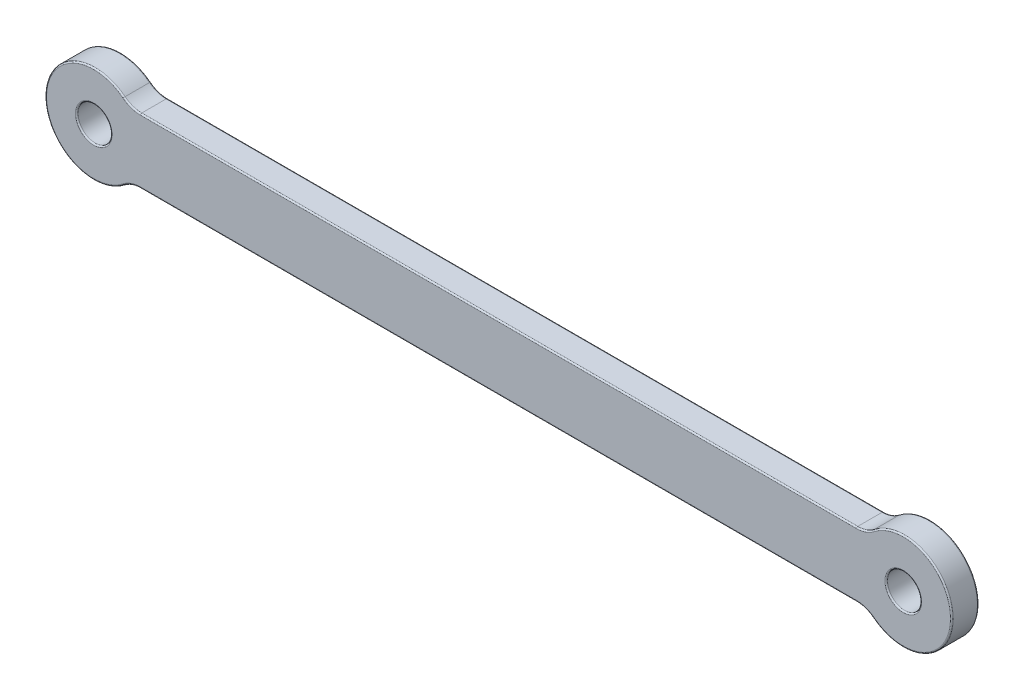
ISO-10303-21;
HEADER;
FILE_DESCRIPTION(('STEP AP214'),'2;1');
FILE_NAME('part.step','',(''),(''),'','','');
FILE_SCHEMA(('AUTOMOTIVE_DESIGN { 1 0 10303 214 1 1 1 1 }'));
ENDSEC;
DATA;
#1=APPLICATION_CONTEXT('core data for automotive mechanical design processes');
#2=APPLICATION_PROTOCOL_DEFINITION('international standard','automotive_design',2000,#1);
#3=PRODUCT_CONTEXT('',#1,'mechanical');
#4=PRODUCT('Part','Part','',(#3));
#5=PRODUCT_RELATED_PRODUCT_CATEGORY('part','',(#4));
#6=PRODUCT_DEFINITION_FORMATION('','',#4);
#7=PRODUCT_DEFINITION_CONTEXT('part definition',#1,'design');
#8=PRODUCT_DEFINITION('design','',#6,#7);
#9=PRODUCT_DEFINITION_SHAPE('','',#8);
#10=(LENGTH_UNIT() NAMED_UNIT(*) SI_UNIT(.MILLI.,.METRE.));
#11=(NAMED_UNIT(*) PLANE_ANGLE_UNIT() SI_UNIT($,.RADIAN.));
#12=(NAMED_UNIT(*) SI_UNIT($,.STERADIAN.) SOLID_ANGLE_UNIT());
#13=UNCERTAINTY_MEASURE_WITH_UNIT(LENGTH_MEASURE(1.E-05),#10,'distance_accuracy_value','');
#14=(GEOMETRIC_REPRESENTATION_CONTEXT(3) GLOBAL_UNCERTAINTY_ASSIGNED_CONTEXT((#13)) GLOBAL_UNIT_ASSIGNED_CONTEXT((#10,
#11,#12)) REPRESENTATION_CONTEXT('',''));
#15=CARTESIAN_POINT('',(0.,0.,0.));
#16=DIRECTION('',(0.,0.,1.));
#17=DIRECTION('',(1.,0.,0.));
#18=AXIS2_PLACEMENT_3D('',#15,#16,#17);
#19=CARTESIAN_POINT('',(150.,0.,5.));
#20=DIRECTION('',(0.,0.,-1.));
#21=DIRECTION('',(-1.,0.,0.));
#22=AXIS2_PLACEMENT_3D('',#19,#20,#21);
#23=CYLINDRICAL_SURFACE('',#22,9.00000000000001);
#24=DIRECTION('',(0.,0.,-1.));
#25=VECTOR('',#24,1.);
#26=CARTESIAN_POINT('',(144.432693832814,-7.07142857142858,5.));
#27=LINE('',#26,#25);
#28=CARTESIAN_POINT('',(144.432693832814,-7.07142857142858,4.75));
#29=VERTEX_POINT('',#28);
#30=CARTESIAN_POINT('',(144.432693832814,-7.07142857142858,0.25));
#31=VERTEX_POINT('',#30);
#32=EDGE_CURVE('E368',#29,#31,#27,.T.);
#33=ORIENTED_EDGE('',*,*,#32,.T.);
#34=CARTESIAN_POINT('',(150.,0.,0.25));
#35=DIRECTION('',(0.,0.,1.));
#36=DIRECTION('',(1.,0.,0.));
#37=AXIS2_PLACEMENT_3D('',#34,#35,#36);
#38=CIRCLE('',#37,9.00000000000001);
#39=CARTESIAN_POINT('',(144.432693832814,7.07142857142858,0.25));
#40=VERTEX_POINT('',#39);
#41=EDGE_CURVE('E251',#31,#40,#38,.T.);
#42=ORIENTED_EDGE('',*,*,#41,.T.);
#43=DIRECTION('',(0.,0.,-1.));
#44=VECTOR('',#43,1.);
#45=CARTESIAN_POINT('',(144.432693832814,7.07142857142858,5.));
#46=LINE('',#45,#44);
#47=CARTESIAN_POINT('',(144.432693832814,7.07142857142858,4.75));
#48=VERTEX_POINT('',#47);
#49=EDGE_CURVE('E374',#40,#48,#46,.F.);
#50=ORIENTED_EDGE('',*,*,#49,.T.);
#51=CARTESIAN_POINT('',(150.,0.,4.75));
#52=DIRECTION('',(0.,0.,1.));
#53=DIRECTION('',(1.,0.,0.));
#54=AXIS2_PLACEMENT_3D('',#51,#52,#53);
#55=CIRCLE('',#54,9.00000000000001);
#56=EDGE_CURVE('E248',#48,#29,#55,.F.);
#57=ORIENTED_EDGE('',*,*,#56,.T.);
#58=EDGE_LOOP('',(#33,#42,#50,#57));
#59=FACE_BOUND('',#58,.T.);
#60=ADVANCED_FACE('F43',(#59),#23,.T.);
#61=CARTESIAN_POINT('',(0.,6.,5.));
#62=DIRECTION('',(0.,1.,0.));
#63=DIRECTION('',(0.,0.,1.));
#64=AXIS2_PLACEMENT_3D('',#61,#62,#63);
#65=PLANE('',#64);
#66=DIRECTION('',(0.,0.,1.));
#67=VECTOR('',#66,1.);
#68=CARTESIAN_POINT('',(141.339745962156,6.,0.));
#69=LINE('',#68,#67);
#70=CARTESIAN_POINT('',(141.339745962156,6.,4.75));
#71=VERTEX_POINT('',#70);
#72=CARTESIAN_POINT('',(141.339745962156,6.,0.25));
#73=VERTEX_POINT('',#72);
#74=EDGE_CURVE('E181',#71,#73,#69,.F.);
#75=ORIENTED_EDGE('',*,*,#74,.T.);
#76=DIRECTION('',(1.,0.,0.));
#77=VECTOR('',#76,1.);
#78=CARTESIAN_POINT('',(8.66025403784439,6.,0.25));
#79=LINE('',#78,#77);
#80=CARTESIAN_POINT('',(8.66025403784439,6.,0.25));
#81=VERTEX_POINT('',#80);
#82=EDGE_CURVE('E263',#73,#81,#79,.F.);
#83=ORIENTED_EDGE('',*,*,#82,.T.);
#84=DIRECTION('',(0.,0.,-1.));
#85=VECTOR('',#84,1.);
#86=CARTESIAN_POINT('',(8.66025403784439,6.,5.));
#87=LINE('',#86,#85);
#88=CARTESIAN_POINT('',(8.66025403784439,6.,4.75));
#89=VERTEX_POINT('',#88);
#90=EDGE_CURVE('E360',#81,#89,#87,.F.);
#91=ORIENTED_EDGE('',*,*,#90,.T.);
#92=DIRECTION('',(1.,0.,0.));
#93=VECTOR('',#92,1.);
#94=CARTESIAN_POINT('',(0.,6.,4.75));
#95=LINE('',#94,#93);
#96=EDGE_CURVE('E260',#89,#71,#95,.T.);
#97=ORIENTED_EDGE('',*,*,#96,.T.);
#98=EDGE_LOOP('',(#75,#83,#91,#97));
#99=FACE_BOUND('',#98,.T.);
#100=ADVANCED_FACE('F365',(#99),#65,.T.);
#101=CARTESIAN_POINT('',(0.,0.,5.));
#102=DIRECTION('',(0.,0.,-1.));
#103=DIRECTION('',(-1.,0.,0.));
#104=AXIS2_PLACEMENT_3D('',#101,#102,#103);
#105=CYLINDRICAL_SURFACE('',#104,9.);
#106=DIRECTION('',(0.,0.,-1.));
#107=VECTOR('',#106,1.);
#108=CARTESIAN_POINT('',(5.56730616718568,7.07142857142857,5.));
#109=LINE('',#108,#107);
#110=CARTESIAN_POINT('',(5.56730616718568,7.07142857142857,4.75));
#111=VERTEX_POINT('',#110);
#112=CARTESIAN_POINT('',(5.56730616718568,7.07142857142857,0.25));
#113=VERTEX_POINT('',#112);
#114=EDGE_CURVE('E362',#111,#113,#109,.T.);
#115=ORIENTED_EDGE('',*,*,#114,.T.);
#116=CARTESIAN_POINT('',(0.,0.,0.25));
#117=DIRECTION('',(0.,0.,1.));
#118=DIRECTION('',(1.,0.,0.));
#119=AXIS2_PLACEMENT_3D('',#116,#117,#118);
#120=CIRCLE('',#119,9.);
#121=CARTESIAN_POINT('',(5.56730616718568,-7.07142857142857,0.25));
#122=VERTEX_POINT('',#121);
#123=EDGE_CURVE('E226',#113,#122,#120,.T.);
#124=ORIENTED_EDGE('',*,*,#123,.T.);
#125=DIRECTION('',(0.,0.,-1.));
#126=VECTOR('',#125,1.);
#127=CARTESIAN_POINT('',(5.56730616718568,-7.07142857142857,5.));
#128=LINE('',#127,#126);
#129=CARTESIAN_POINT('',(5.56730616718568,-7.07142857142857,4.75));
#130=VERTEX_POINT('',#129);
#131=EDGE_CURVE('E404',#122,#130,#128,.F.);
#132=ORIENTED_EDGE('',*,*,#131,.T.);
#133=CARTESIAN_POINT('',(0.,0.,4.75));
#134=DIRECTION('',(0.,0.,1.));
#135=DIRECTION('',(1.,0.,0.));
#136=AXIS2_PLACEMENT_3D('',#133,#134,#135);
#137=CIRCLE('',#136,9.);
#138=EDGE_CURVE('E223',#130,#111,#137,.F.);
#139=ORIENTED_EDGE('',*,*,#138,.T.);
#140=EDGE_LOOP('',(#115,#124,#132,#139));
#141=FACE_BOUND('',#140,.T.);
#142=ADVANCED_FACE('F402',(#141),#105,.T.);
#143=CARTESIAN_POINT('',(150.,0.,5.));
#144=DIRECTION('',(0.,0.,-1.));
#145=DIRECTION('',(-1.,0.,0.));
#146=AXIS2_PLACEMENT_3D('',#143,#144,#145);
#147=CYLINDRICAL_SURFACE('',#146,3.15000000000001);
#148=CARTESIAN_POINT('',(150.,0.,0.25));
#149=DIRECTION('',(0.,0.,1.));
#150=DIRECTION('',(1.,0.,0.));
#151=AXIS2_PLACEMENT_3D('',#148,#149,#150);
#152=CIRCLE('',#151,3.15000000000001);
#153=CARTESIAN_POINT('',(153.15,0.,0.25));
#154=VERTEX_POINT('',#153);
#155=EDGE_CURVE('E214',#154,#154,#152,.F.);
#156=ORIENTED_EDGE('',*,*,#155,.T.);
#157=EDGE_LOOP('',(#156));
#158=FACE_BOUND('',#157,.T.);
#159=CARTESIAN_POINT('',(150.,0.,4.75));
#160=DIRECTION('',(0.,0.,1.));
#161=DIRECTION('',(1.,0.,0.));
#162=AXIS2_PLACEMENT_3D('',#159,#160,#161);
#163=CIRCLE('',#162,3.15000000000001);
#164=CARTESIAN_POINT('',(153.15,0.,4.75));
#165=VERTEX_POINT('',#164);
#166=EDGE_CURVE('E210',#165,#165,#163,.T.);
#167=ORIENTED_EDGE('',*,*,#166,.T.);
#168=EDGE_LOOP('',(#167));
#169=FACE_BOUND('',#168,.T.);
#170=ADVANCED_FACE('F720',(#158,#169),#147,.F.);
#171=CARTESIAN_POINT('',(0.,-6.,5.));
#172=DIRECTION('',(0.,1.,0.));
#173=DIRECTION('',(0.,0.,1.));
#174=AXIS2_PLACEMENT_3D('',#171,#172,#173);
#175=PLANE('',#174);
#176=DIRECTION('',(0.,0.,1.));
#177=VECTOR('',#176,1.);
#178=CARTESIAN_POINT('',(8.66025403784439,-6.,0.));
#179=LINE('',#178,#177);
#180=CARTESIAN_POINT('',(8.66025403784439,-6.,4.75));
#181=VERTEX_POINT('',#180);
#182=CARTESIAN_POINT('',(8.66025403784439,-6.,0.25));
#183=VERTEX_POINT('',#182);
#184=EDGE_CURVE('E405',#181,#183,#179,.F.);
#185=ORIENTED_EDGE('',*,*,#184,.T.);
#186=DIRECTION('',(1.,0.,0.));
#187=VECTOR('',#186,1.);
#188=CARTESIAN_POINT('',(0.,-6.,0.25));
#189=LINE('',#188,#187);
#190=CARTESIAN_POINT('',(141.339745962156,-6.,0.25));
#191=VERTEX_POINT('',#190);
#192=EDGE_CURVE('E238',#183,#191,#189,.T.);
#193=ORIENTED_EDGE('',*,*,#192,.T.);
#194=DIRECTION('',(0.,0.,-1.));
#195=VECTOR('',#194,1.);
#196=CARTESIAN_POINT('',(141.339745962156,-6.,5.));
#197=LINE('',#196,#195);
#198=CARTESIAN_POINT('',(141.339745962156,-6.,4.75));
#199=VERTEX_POINT('',#198);
#200=EDGE_CURVE('E315',#191,#199,#197,.F.);
#201=ORIENTED_EDGE('',*,*,#200,.T.);
#202=DIRECTION('',(1.,0.,0.));
#203=VECTOR('',#202,1.);
#204=CARTESIAN_POINT('',(8.66025403784439,-6.,4.75));
#205=LINE('',#204,#203);
#206=EDGE_CURVE('E235',#199,#181,#205,.F.);
#207=ORIENTED_EDGE('',*,*,#206,.T.);
#208=EDGE_LOOP('',(#185,#193,#201,#207));
#209=FACE_BOUND('',#208,.T.);
#210=ADVANCED_FACE('F442',(#209),#175,.F.);
#211=CARTESIAN_POINT('',(0.,0.,5.));
#212=DIRECTION('',(0.,0.,-1.));
#213=DIRECTION('',(-1.,0.,0.));
#214=AXIS2_PLACEMENT_3D('',#211,#212,#213);
#215=CYLINDRICAL_SURFACE('',#214,3.15);
#216=CARTESIAN_POINT('',(0.,0.,0.25));
#217=DIRECTION('',(0.,0.,1.));
#218=DIRECTION('',(1.,0.,0.));
#219=AXIS2_PLACEMENT_3D('',#216,#217,#218);
#220=CIRCLE('',#219,3.15);
#221=CARTESIAN_POINT('',(3.15,0.,0.25));
#222=VERTEX_POINT('',#221);
#223=EDGE_CURVE('E206',#222,#222,#220,.F.);
#224=ORIENTED_EDGE('',*,*,#223,.T.);
#225=EDGE_LOOP('',(#224));
#226=FACE_BOUND('',#225,.T.);
#227=CARTESIAN_POINT('',(0.,0.,4.75));
#228=DIRECTION('',(0.,0.,1.));
#229=DIRECTION('',(1.,0.,0.));
#230=AXIS2_PLACEMENT_3D('',#227,#228,#229);
#231=CIRCLE('',#230,3.15);
#232=CARTESIAN_POINT('',(3.15,0.,4.75));
#233=VERTEX_POINT('',#232);
#234=EDGE_CURVE('E202',#233,#233,#231,.T.);
#235=ORIENTED_EDGE('',*,*,#234,.T.);
#236=EDGE_LOOP('',(#235));
#237=FACE_BOUND('',#236,.T.);
#238=ADVANCED_FACE('F696',(#226,#237),#215,.F.);
#239=CARTESIAN_POINT('',(0.,0.,5.));
#240=DIRECTION('',(0.,0.,1.));
#241=DIRECTION('',(1.,0.,0.));
#242=AXIS2_PLACEMENT_3D('',#239,#240,#241);
#243=PLANE('',#242);
#244=CARTESIAN_POINT('',(0.,0.,5.));
#245=DIRECTION('',(0.,0.,1.));
#246=DIRECTION('',(1.,0.,0.));
#247=AXIS2_PLACEMENT_3D('',#244,#245,#246);
#248=CIRCLE('',#247,3.4);
#249=CARTESIAN_POINT('',(3.4,0.,5.));
#250=VERTEX_POINT('',#249);
#251=EDGE_CURVE('E11',#250,#250,#248,.F.);
#252=ORIENTED_EDGE('',*,*,#251,.T.);
#253=EDGE_LOOP('',(#252));
#254=FACE_BOUND('',#253,.T.);
#255=CARTESIAN_POINT('',(150.,0.,5.));
#256=DIRECTION('',(0.,0.,1.));
#257=DIRECTION('',(1.,0.,0.));
#258=AXIS2_PLACEMENT_3D('',#255,#256,#257);
#259=CIRCLE('',#258,3.40000000000001);
#260=CARTESIAN_POINT('',(153.4,0.,5.));
#261=VERTEX_POINT('',#260);
#262=EDGE_CURVE('E53',#261,#261,#259,.F.);
#263=ORIENTED_EDGE('',*,*,#262,.T.);
#264=EDGE_LOOP('',(#263));
#265=FACE_BOUND('',#264,.T.);
#266=DIRECTION('',(1.,0.,0.));
#267=VECTOR('',#266,1.);
#268=CARTESIAN_POINT('',(141.339745962156,-5.75,5.));
#269=LINE('',#268,#267);
#270=CARTESIAN_POINT('',(8.66025403784439,-5.75,5.));
#271=VERTEX_POINT('',#270);
#272=CARTESIAN_POINT('',(141.339745962156,-5.75,5.));
#273=VERTEX_POINT('',#272);
#274=EDGE_CURVE('E61',#271,#273,#269,.T.);
#275=ORIENTED_EDGE('',*,*,#274,.T.);
#276=CARTESIAN_POINT('',(141.339745962156,-11.,5.));
#277=DIRECTION('',(0.,0.,1.));
#278=DIRECTION('',(1.,0.,0.));
#279=AXIS2_PLACEMENT_3D('',#276,#277,#278);
#280=CIRCLE('',#279,5.25);
#281=CARTESIAN_POINT('',(144.587341226347,-6.87500000000001,5.));
#282=VERTEX_POINT('',#281);
#283=EDGE_CURVE('E285',#273,#282,#280,.F.);
#284=ORIENTED_EDGE('',*,*,#283,.T.);
#285=CARTESIAN_POINT('',(150.,0.,5.));
#286=DIRECTION('',(0.,0.,1.));
#287=DIRECTION('',(1.,0.,0.));
#288=AXIS2_PLACEMENT_3D('',#285,#286,#287);
#289=CIRCLE('',#288,8.75000000000001);
#290=CARTESIAN_POINT('',(144.587341226347,6.87500000000001,5.));
#291=VERTEX_POINT('',#290);
#292=EDGE_CURVE('E266',#282,#291,#289,.T.);
#293=ORIENTED_EDGE('',*,*,#292,.T.);
#294=CARTESIAN_POINT('',(141.339745962156,11.,5.));
#295=DIRECTION('',(0.,0.,1.));
#296=DIRECTION('',(1.,0.,0.));
#297=AXIS2_PLACEMENT_3D('',#294,#295,#296);
#298=CIRCLE('',#297,5.25);
#299=CARTESIAN_POINT('',(141.339745962156,5.75,5.));
#300=VERTEX_POINT('',#299);
#301=EDGE_CURVE('E269',#291,#300,#298,.F.);
#302=ORIENTED_EDGE('',*,*,#301,.T.);
#303=DIRECTION('',(1.,0.,0.));
#304=VECTOR('',#303,1.);
#305=CARTESIAN_POINT('',(0.,5.75,5.));
#306=LINE('',#305,#304);
#307=CARTESIAN_POINT('',(8.66025403784439,5.75,5.));
#308=VERTEX_POINT('',#307);
#309=EDGE_CURVE('E272',#300,#308,#306,.F.);
#310=ORIENTED_EDGE('',*,*,#309,.T.);
#311=CARTESIAN_POINT('',(8.66025403784439,11.,5.));
#312=DIRECTION('',(0.,0.,1.));
#313=DIRECTION('',(1.,0.,0.));
#314=AXIS2_PLACEMENT_3D('',#311,#312,#313);
#315=CIRCLE('',#314,5.25);
#316=CARTESIAN_POINT('',(5.41265877365274,6.875,5.));
#317=VERTEX_POINT('',#316);
#318=EDGE_CURVE('E275',#308,#317,#315,.F.);
#319=ORIENTED_EDGE('',*,*,#318,.T.);
#320=CARTESIAN_POINT('',(0.,0.,5.));
#321=DIRECTION('',(0.,0.,1.));
#322=DIRECTION('',(1.,0.,0.));
#323=AXIS2_PLACEMENT_3D('',#320,#321,#322);
#324=CIRCLE('',#323,8.75);
#325=CARTESIAN_POINT('',(5.41265877365274,-6.875,5.));
#326=VERTEX_POINT('',#325);
#327=EDGE_CURVE('E278',#317,#326,#324,.T.);
#328=ORIENTED_EDGE('',*,*,#327,.T.);
#329=CARTESIAN_POINT('',(8.66025403784439,-11.,5.));
#330=DIRECTION('',(0.,0.,1.));
#331=DIRECTION('',(1.,0.,0.));
#332=AXIS2_PLACEMENT_3D('',#329,#330,#331);
#333=CIRCLE('',#332,5.25);
#334=EDGE_CURVE('E66',#326,#271,#333,.F.);
#335=ORIENTED_EDGE('',*,*,#334,.T.);
#336=EDGE_LOOP('',(#275,#284,#293,#302,#310,#319,#328,#335));
#337=FACE_BOUND('',#336,.T.);
#338=ADVANCED_FACE('F462',(#254,#265,#337),#243,.T.);
#339=CARTESIAN_POINT('',(0.,0.,0.));
#340=DIRECTION('',(0.,0.,1.));
#341=DIRECTION('',(1.,0.,0.));
#342=AXIS2_PLACEMENT_3D('',#339,#340,#341);
#343=PLANE('',#342);
#344=CARTESIAN_POINT('',(0.,0.,0.));
#345=DIRECTION('',(0.,0.,1.));
#346=DIRECTION('',(1.,0.,0.));
#347=AXIS2_PLACEMENT_3D('',#344,#345,#346);
#348=CIRCLE('',#347,3.4);
#349=CARTESIAN_POINT('',(3.4,0.,0.));
#350=VERTEX_POINT('',#349);
#351=EDGE_CURVE('E193',#350,#350,#348,.T.);
#352=ORIENTED_EDGE('',*,*,#351,.T.);
#353=EDGE_LOOP('',(#352));
#354=FACE_BOUND('',#353,.T.);
#355=CARTESIAN_POINT('',(150.,0.,0.));
#356=DIRECTION('',(0.,0.,1.));
#357=DIRECTION('',(1.,0.,0.));
#358=AXIS2_PLACEMENT_3D('',#355,#356,#357);
#359=CIRCLE('',#358,3.40000000000001);
#360=CARTESIAN_POINT('',(153.4,0.,0.));
#361=VERTEX_POINT('',#360);
#362=EDGE_CURVE('E188',#361,#361,#359,.T.);
#363=ORIENTED_EDGE('',*,*,#362,.T.);
#364=EDGE_LOOP('',(#363));
#365=FACE_BOUND('',#364,.T.);
#366=CARTESIAN_POINT('',(0.,0.,0.));
#367=DIRECTION('',(0.,0.,1.));
#368=DIRECTION('',(1.,0.,0.));
#369=AXIS2_PLACEMENT_3D('',#366,#367,#368);
#370=CIRCLE('',#369,8.75);
#371=CARTESIAN_POINT('',(5.41265877365274,-6.875,0.));
#372=VERTEX_POINT('',#371);
#373=CARTESIAN_POINT('',(5.41265877365274,6.875,0.));
#374=VERTEX_POINT('',#373);
#375=EDGE_CURVE('E185',#372,#374,#370,.F.);
#376=ORIENTED_EDGE('',*,*,#375,.T.);
#377=CARTESIAN_POINT('',(8.66025403784439,11.,0.));
#378=DIRECTION('',(0.,0.,1.));
#379=DIRECTION('',(1.,0.,0.));
#380=AXIS2_PLACEMENT_3D('',#377,#378,#379);
#381=CIRCLE('',#380,5.25);
#382=CARTESIAN_POINT('',(8.66025403784439,5.75,0.));
#383=VERTEX_POINT('',#382);
#384=EDGE_CURVE('E164',#374,#383,#381,.T.);
#385=ORIENTED_EDGE('',*,*,#384,.T.);
#386=DIRECTION('',(1.,0.,0.));
#387=VECTOR('',#386,1.);
#388=CARTESIAN_POINT('',(141.339745962156,5.75,0.));
#389=LINE('',#388,#387);
#390=CARTESIAN_POINT('',(141.339745962156,5.75,0.));
#391=VERTEX_POINT('',#390);
#392=EDGE_CURVE('E173',#383,#391,#389,.T.);
#393=ORIENTED_EDGE('',*,*,#392,.T.);
#394=CARTESIAN_POINT('',(141.339745962156,11.,0.));
#395=DIRECTION('',(0.,0.,1.));
#396=DIRECTION('',(1.,0.,0.));
#397=AXIS2_PLACEMENT_3D('',#394,#395,#396);
#398=CIRCLE('',#397,5.25);
#399=CARTESIAN_POINT('',(144.587341226347,6.87500000000001,0.));
#400=VERTEX_POINT('',#399);
#401=EDGE_CURVE('E180',#391,#400,#398,.T.);
#402=ORIENTED_EDGE('',*,*,#401,.T.);
#403=CARTESIAN_POINT('',(150.,0.,0.));
#404=DIRECTION('',(0.,0.,1.));
#405=DIRECTION('',(1.,0.,0.));
#406=AXIS2_PLACEMENT_3D('',#403,#404,#405);
#407=CIRCLE('',#406,8.75000000000001);
#408=CARTESIAN_POINT('',(144.587341226347,-6.87500000000001,0.));
#409=VERTEX_POINT('',#408);
#410=EDGE_CURVE('E380',#400,#409,#407,.F.);
#411=ORIENTED_EDGE('',*,*,#410,.T.);
#412=CARTESIAN_POINT('',(141.339745962156,-11.,0.));
#413=DIRECTION('',(0.,0.,1.));
#414=DIRECTION('',(1.,0.,0.));
#415=AXIS2_PLACEMENT_3D('',#412,#413,#414);
#416=CIRCLE('',#415,5.25);
#417=CARTESIAN_POINT('',(141.339745962156,-5.75,0.));
#418=VERTEX_POINT('',#417);
#419=EDGE_CURVE('E383',#409,#418,#416,.T.);
#420=ORIENTED_EDGE('',*,*,#419,.T.);
#421=DIRECTION('',(1.,0.,0.));
#422=VECTOR('',#421,1.);
#423=CARTESIAN_POINT('',(0.,-5.75,0.));
#424=LINE('',#423,#422);
#425=CARTESIAN_POINT('',(8.66025403784439,-5.75,0.));
#426=VERTEX_POINT('',#425);
#427=EDGE_CURVE('E386',#418,#426,#424,.F.);
#428=ORIENTED_EDGE('',*,*,#427,.T.);
#429=CARTESIAN_POINT('',(8.66025403784439,-11.,0.));
#430=DIRECTION('',(0.,0.,1.));
#431=DIRECTION('',(1.,0.,0.));
#432=AXIS2_PLACEMENT_3D('',#429,#430,#431);
#433=CIRCLE('',#432,5.25);
#434=EDGE_CURVE('E195',#426,#372,#433,.T.);
#435=ORIENTED_EDGE('',*,*,#434,.T.);
#436=EDGE_LOOP('',(#376,#385,#393,#402,#411,#420,#428,#435));
#437=FACE_BOUND('',#436,.T.);
#438=ADVANCED_FACE('F183',(#354,#365,#437),#343,.F.);
#439=CARTESIAN_POINT('',(8.66025403784439,-11.,5.));
#440=DIRECTION('',(0.,0.,-1.));
#441=DIRECTION('',(-1.,0.,0.));
#442=AXIS2_PLACEMENT_3D('',#439,#440,#441);
#443=CYLINDRICAL_SURFACE('',#442,5.);
#444=ORIENTED_EDGE('',*,*,#131,.F.);
#445=CARTESIAN_POINT('',(8.66025403784439,-11.,0.25));
#446=DIRECTION('',(0.,0.,1.));
#447=DIRECTION('',(1.,0.,0.));
#448=AXIS2_PLACEMENT_3D('',#445,#446,#447);
#449=CIRCLE('',#448,5.);
#450=EDGE_CURVE('E232',#122,#183,#449,.F.);
#451=ORIENTED_EDGE('',*,*,#450,.T.);
#452=ORIENTED_EDGE('',*,*,#184,.F.);
#453=CARTESIAN_POINT('',(8.66025403784439,-11.,4.75));
#454=DIRECTION('',(0.,0.,1.));
#455=DIRECTION('',(1.,0.,0.));
#456=AXIS2_PLACEMENT_3D('',#453,#454,#455);
#457=CIRCLE('',#456,5.);
#458=EDGE_CURVE('E229',#181,#130,#457,.T.);
#459=ORIENTED_EDGE('',*,*,#458,.T.);
#460=EDGE_LOOP('',(#444,#451,#452,#459));
#461=FACE_BOUND('',#460,.T.);
#462=ADVANCED_FACE('F484',(#461),#443,.F.);
#463=CARTESIAN_POINT('',(141.339745962156,-11.,5.));
#464=DIRECTION('',(0.,0.,-1.));
#465=DIRECTION('',(-1.,0.,0.));
#466=AXIS2_PLACEMENT_3D('',#463,#464,#465);
#467=CYLINDRICAL_SURFACE('',#466,5.);
#468=ORIENTED_EDGE('',*,*,#200,.F.);
#469=CARTESIAN_POINT('',(141.339745962156,-11.,0.25));
#470=DIRECTION('',(0.,0.,1.));
#471=DIRECTION('',(1.,0.,0.));
#472=AXIS2_PLACEMENT_3D('',#469,#470,#471);
#473=CIRCLE('',#472,5.);
#474=EDGE_CURVE('E245',#191,#31,#473,.F.);
#475=ORIENTED_EDGE('',*,*,#474,.T.);
#476=ORIENTED_EDGE('',*,*,#32,.F.);
#477=CARTESIAN_POINT('',(141.339745962156,-11.,4.75));
#478=DIRECTION('',(0.,0.,1.));
#479=DIRECTION('',(1.,0.,0.));
#480=AXIS2_PLACEMENT_3D('',#477,#478,#479);
#481=CIRCLE('',#480,5.);
#482=EDGE_CURVE('E241',#29,#199,#481,.T.);
#483=ORIENTED_EDGE('',*,*,#482,.T.);
#484=EDGE_LOOP('',(#468,#475,#476,#483));
#485=FACE_BOUND('',#484,.T.);
#486=ADVANCED_FACE('F439',(#485),#467,.F.);
#487=CARTESIAN_POINT('',(141.339745962156,11.,5.));
#488=DIRECTION('',(0.,0.,-1.));
#489=DIRECTION('',(-1.,0.,0.));
#490=AXIS2_PLACEMENT_3D('',#487,#488,#489);
#491=CYLINDRICAL_SURFACE('',#490,5.);
#492=ORIENTED_EDGE('',*,*,#49,.F.);
#493=CARTESIAN_POINT('',(141.339745962156,11.,0.25));
#494=DIRECTION('',(0.,0.,1.));
#495=DIRECTION('',(1.,0.,0.));
#496=AXIS2_PLACEMENT_3D('',#493,#494,#495);
#497=CIRCLE('',#496,5.);
#498=EDGE_CURVE('E257',#40,#73,#497,.F.);
#499=ORIENTED_EDGE('',*,*,#498,.T.);
#500=ORIENTED_EDGE('',*,*,#74,.F.);
#501=CARTESIAN_POINT('',(141.339745962156,11.,4.75));
#502=DIRECTION('',(0.,0.,1.));
#503=DIRECTION('',(1.,0.,0.));
#504=AXIS2_PLACEMENT_3D('',#501,#502,#503);
#505=CIRCLE('',#504,5.);
#506=EDGE_CURVE('E254',#71,#48,#505,.T.);
#507=ORIENTED_EDGE('',*,*,#506,.T.);
#508=EDGE_LOOP('',(#492,#499,#500,#507));
#509=FACE_BOUND('',#508,.T.);
#510=ADVANCED_FACE('F459',(#509),#491,.F.);
#511=CARTESIAN_POINT('',(8.66025403784439,11.,5.));
#512=DIRECTION('',(0.,0.,-1.));
#513=DIRECTION('',(-1.,0.,0.));
#514=AXIS2_PLACEMENT_3D('',#511,#512,#513);
#515=CYLINDRICAL_SURFACE('',#514,5.);
#516=ORIENTED_EDGE('',*,*,#90,.F.);
#517=CARTESIAN_POINT('',(8.66025403784439,11.,0.25));
#518=DIRECTION('',(0.,0.,1.));
#519=DIRECTION('',(1.,0.,0.));
#520=AXIS2_PLACEMENT_3D('',#517,#518,#519);
#521=CIRCLE('',#520,5.);
#522=EDGE_CURVE('E166',#81,#113,#521,.F.);
#523=ORIENTED_EDGE('',*,*,#522,.T.);
#524=ORIENTED_EDGE('',*,*,#114,.F.);
#525=CARTESIAN_POINT('',(8.66025403784439,11.,4.75));
#526=DIRECTION('',(0.,0.,1.));
#527=DIRECTION('',(1.,0.,0.));
#528=AXIS2_PLACEMENT_3D('',#525,#526,#527);
#529=CIRCLE('',#528,5.);
#530=EDGE_CURVE('E218',#111,#89,#529,.T.);
#531=ORIENTED_EDGE('',*,*,#530,.T.);
#532=EDGE_LOOP('',(#516,#523,#524,#531));
#533=FACE_BOUND('',#532,.T.);
#534=ADVANCED_FACE('F359',(#533),#515,.F.);
#535=CARTESIAN_POINT('',(0.,0.,0.25));
#536=DIRECTION('',(0.,0.,1.));
#537=DIRECTION('',(1.,0.,0.));
#538=AXIS2_PLACEMENT_3D('',#535,#536,#537);
#539=TOROIDAL_SURFACE('',#538,3.4,0.25);
#540=ORIENTED_EDGE('',*,*,#223,.F.);
#541=EDGE_LOOP('',(#540));
#542=FACE_BOUND('',#541,.T.);
#543=ORIENTED_EDGE('',*,*,#351,.F.);
#544=EDGE_LOOP('',(#543));
#545=FACE_BOUND('',#544,.T.);
#546=ADVANCED_FACE('F494',(#542,#545),#539,.T.);
#547=CARTESIAN_POINT('',(150.,0.,0.25));
#548=DIRECTION('',(0.,0.,1.));
#549=DIRECTION('',(1.,0.,0.));
#550=AXIS2_PLACEMENT_3D('',#547,#548,#549);
#551=TOROIDAL_SURFACE('',#550,3.40000000000001,0.25);
#552=ORIENTED_EDGE('',*,*,#362,.F.);
#553=EDGE_LOOP('',(#552));
#554=FACE_BOUND('',#553,.T.);
#555=ORIENTED_EDGE('',*,*,#155,.F.);
#556=EDGE_LOOP('',(#555));
#557=FACE_BOUND('',#556,.T.);
#558=ADVANCED_FACE('F497',(#554,#557),#551,.T.);
#559=CARTESIAN_POINT('',(141.339745962156,-11.,0.25));
#560=DIRECTION('',(0.,0.,1.));
#561=DIRECTION('',(1.,0.,0.));
#562=AXIS2_PLACEMENT_3D('',#559,#560,#561);
#563=TOROIDAL_SURFACE('',#562,5.25,0.25);
#564=CARTESIAN_POINT('',(144.587341226347,-6.87500000000001,0.25));
#565=DIRECTION('',(0.785714285714283,-0.618589574131746,0.));
#566=DIRECTION('',(0.618589574131746,0.785714285714283,0.));
#567=AXIS2_PLACEMENT_3D('',#564,#565,#566);
#568=CIRCLE('',#567,0.25);
#569=EDGE_CURVE('E307',#31,#409,#568,.T.);
#570=ORIENTED_EDGE('',*,*,#569,.F.);
#571=ORIENTED_EDGE('',*,*,#474,.F.);
#572=CARTESIAN_POINT('',(141.339745962156,-5.75,0.25));
#573=DIRECTION('',(-1.,0.,0.));
#574=DIRECTION('',(0.,0.,1.));
#575=AXIS2_PLACEMENT_3D('',#572,#573,#574);
#576=CIRCLE('',#575,0.25);
#577=EDGE_CURVE('E311',#418,#191,#576,.T.);
#578=ORIENTED_EDGE('',*,*,#577,.F.);
#579=ORIENTED_EDGE('',*,*,#419,.F.);
#580=EDGE_LOOP('',(#570,#571,#578,#579));
#581=FACE_BOUND('',#580,.T.);
#582=ADVANCED_FACE('F452',(#581),#563,.T.);
#583=CARTESIAN_POINT('',(0.,-5.75,0.25));
#584=DIRECTION('',(1.,0.,0.));
#585=DIRECTION('',(0.,0.,-1.));
#586=AXIS2_PLACEMENT_3D('',#583,#584,#585);
#587=CYLINDRICAL_SURFACE('',#586,0.25);
#588=ORIENTED_EDGE('',*,*,#577,.T.);
#589=ORIENTED_EDGE('',*,*,#192,.F.);
#590=CARTESIAN_POINT('',(8.66025403784439,-5.75,0.25));
#591=DIRECTION('',(-1.,0.,0.));
#592=DIRECTION('',(0.,0.,1.));
#593=AXIS2_PLACEMENT_3D('',#590,#591,#592);
#594=CIRCLE('',#593,0.25);
#595=EDGE_CURVE('E303',#426,#183,#594,.T.);
#596=ORIENTED_EDGE('',*,*,#595,.F.);
#597=ORIENTED_EDGE('',*,*,#427,.F.);
#598=EDGE_LOOP('',(#588,#589,#596,#597));
#599=FACE_BOUND('',#598,.T.);
#600=ADVANCED_FACE('F447',(#599),#587,.T.);
#601=CARTESIAN_POINT('',(150.,0.,0.25));
#602=DIRECTION('',(0.,0.,1.));
#603=DIRECTION('',(1.,0.,0.));
#604=AXIS2_PLACEMENT_3D('',#601,#602,#603);
#605=TOROIDAL_SURFACE('',#604,8.75000000000001,0.25);
#606=ORIENTED_EDGE('',*,*,#569,.T.);
#607=ORIENTED_EDGE('',*,*,#410,.F.);
#608=CARTESIAN_POINT('',(144.587341226347,6.87500000000001,0.25));
#609=DIRECTION('',(-0.785714285714284,-0.618589574131744,0.));
#610=DIRECTION('',(0.618589574131744,-0.785714285714284,0.));
#611=AXIS2_PLACEMENT_3D('',#608,#609,#610);
#612=CIRCLE('',#611,0.25);
#613=EDGE_CURVE('E299',#40,#400,#612,.T.);
#614=ORIENTED_EDGE('',*,*,#613,.F.);
#615=ORIENTED_EDGE('',*,*,#41,.F.);
#616=EDGE_LOOP('',(#606,#607,#614,#615));
#617=FACE_BOUND('',#616,.T.);
#618=ADVANCED_FACE('F455',(#617),#605,.T.);
#619=CARTESIAN_POINT('',(8.66025403784439,-11.,0.25));
#620=DIRECTION('',(0.,0.,1.));
#621=DIRECTION('',(1.,0.,0.));
#622=AXIS2_PLACEMENT_3D('',#619,#620,#621);
#623=TOROIDAL_SURFACE('',#622,5.25,0.25);
#624=ORIENTED_EDGE('',*,*,#595,.T.);
#625=ORIENTED_EDGE('',*,*,#450,.F.);
#626=CARTESIAN_POINT('',(5.41265877365274,-6.875,0.25));
#627=DIRECTION('',(-0.785714285714286,-0.618589574131742,0.));
#628=DIRECTION('',(0.618589574131742,-0.785714285714286,0.));
#629=AXIS2_PLACEMENT_3D('',#626,#627,#628);
#630=CIRCLE('',#629,0.25);
#631=EDGE_CURVE('E295',#372,#122,#630,.T.);
#632=ORIENTED_EDGE('',*,*,#631,.F.);
#633=ORIENTED_EDGE('',*,*,#434,.F.);
#634=EDGE_LOOP('',(#624,#625,#632,#633));
#635=FACE_BOUND('',#634,.T.);
#636=ADVANCED_FACE('F395',(#635),#623,.T.);
#637=CARTESIAN_POINT('',(141.339745962156,11.,0.25));
#638=DIRECTION('',(0.,0.,1.));
#639=DIRECTION('',(1.,0.,0.));
#640=AXIS2_PLACEMENT_3D('',#637,#638,#639);
#641=TOROIDAL_SURFACE('',#640,5.25,0.25);
#642=ORIENTED_EDGE('',*,*,#613,.T.);
#643=ORIENTED_EDGE('',*,*,#401,.F.);
#644=CARTESIAN_POINT('',(141.339745962156,5.75,0.25));
#645=DIRECTION('',(-1.,0.,0.));
#646=DIRECTION('',(0.,0.,1.));
#647=AXIS2_PLACEMENT_3D('',#644,#645,#646);
#648=CIRCLE('',#647,0.25);
#649=EDGE_CURVE('E176',#73,#391,#648,.T.);
#650=ORIENTED_EDGE('',*,*,#649,.F.);
#651=ORIENTED_EDGE('',*,*,#498,.F.);
#652=EDGE_LOOP('',(#642,#643,#650,#651));
#653=FACE_BOUND('',#652,.T.);
#654=ADVANCED_FACE('F458',(#653),#641,.T.);
#655=CARTESIAN_POINT('',(0.,0.,0.25));
#656=DIRECTION('',(0.,0.,1.));
#657=DIRECTION('',(1.,0.,0.));
#658=AXIS2_PLACEMENT_3D('',#655,#656,#657);
#659=TOROIDAL_SURFACE('',#658,8.75,0.25);
#660=ORIENTED_EDGE('',*,*,#631,.T.);
#661=ORIENTED_EDGE('',*,*,#123,.F.);
#662=CARTESIAN_POINT('',(5.41265877365274,6.875,0.25));
#663=DIRECTION('',(0.785714285714286,-0.618589574131742,0.));
#664=DIRECTION('',(0.618589574131742,0.785714285714286,0.));
#665=AXIS2_PLACEMENT_3D('',#662,#663,#664);
#666=CIRCLE('',#665,0.25);
#667=EDGE_CURVE('E170',#374,#113,#666,.T.);
#668=ORIENTED_EDGE('',*,*,#667,.F.);
#669=ORIENTED_EDGE('',*,*,#375,.F.);
#670=EDGE_LOOP('',(#660,#661,#668,#669));
#671=FACE_BOUND('',#670,.T.);
#672=ADVANCED_FACE('F398',(#671),#659,.T.);
#673=CARTESIAN_POINT('',(0.,5.75,0.25));
#674=DIRECTION('',(-1.,0.,0.));
#675=DIRECTION('',(0.,0.,1.));
#676=AXIS2_PLACEMENT_3D('',#673,#674,#675);
#677=CYLINDRICAL_SURFACE('',#676,0.25);
#678=ORIENTED_EDGE('',*,*,#649,.T.);
#679=ORIENTED_EDGE('',*,*,#392,.F.);
#680=CARTESIAN_POINT('',(8.66025403784439,5.75,0.25));
#681=DIRECTION('',(-1.,0.,0.));
#682=DIRECTION('',(0.,0.,1.));
#683=AXIS2_PLACEMENT_3D('',#680,#681,#682);
#684=CIRCLE('',#683,0.25);
#685=EDGE_CURVE('E160',#81,#383,#684,.T.);
#686=ORIENTED_EDGE('',*,*,#685,.F.);
#687=ORIENTED_EDGE('',*,*,#82,.F.);
#688=EDGE_LOOP('',(#678,#679,#686,#687));
#689=FACE_BOUND('',#688,.T.);
#690=ADVANCED_FACE('F174',(#689),#677,.T.);
#691=CARTESIAN_POINT('',(8.66025403784439,11.,0.25));
#692=DIRECTION('',(0.,0.,1.));
#693=DIRECTION('',(1.,0.,0.));
#694=AXIS2_PLACEMENT_3D('',#691,#692,#693);
#695=TOROIDAL_SURFACE('',#694,5.25,0.25);
#696=ORIENTED_EDGE('',*,*,#667,.T.);
#697=ORIENTED_EDGE('',*,*,#522,.F.);
#698=ORIENTED_EDGE('',*,*,#685,.T.);
#699=ORIENTED_EDGE('',*,*,#384,.F.);
#700=EDGE_LOOP('',(#696,#697,#698,#699));
#701=FACE_BOUND('',#700,.T.);
#702=ADVANCED_FACE('F162',(#701),#695,.T.);
#703=CARTESIAN_POINT('',(0.,0.,4.75));
#704=DIRECTION('',(0.,0.,1.));
#705=DIRECTION('',(1.,0.,0.));
#706=AXIS2_PLACEMENT_3D('',#703,#704,#705);
#707=TOROIDAL_SURFACE('',#706,3.4,0.25);
#708=ORIENTED_EDGE('',*,*,#251,.F.);
#709=EDGE_LOOP('',(#708));
#710=FACE_BOUND('',#709,.T.);
#711=ORIENTED_EDGE('',*,*,#234,.F.);
#712=EDGE_LOOP('',(#711));
#713=FACE_BOUND('',#712,.T.);
#714=ADVANCED_FACE('F504',(#710,#713),#707,.T.);
#715=CARTESIAN_POINT('',(150.,0.,4.75));
#716=DIRECTION('',(0.,0.,1.));
#717=DIRECTION('',(1.,0.,0.));
#718=AXIS2_PLACEMENT_3D('',#715,#716,#717);
#719=TOROIDAL_SURFACE('',#718,3.40000000000001,0.25);
#720=ORIENTED_EDGE('',*,*,#166,.F.);
#721=EDGE_LOOP('',(#720));
#722=FACE_BOUND('',#721,.T.);
#723=ORIENTED_EDGE('',*,*,#262,.F.);
#724=EDGE_LOOP('',(#723));
#725=FACE_BOUND('',#724,.T.);
#726=ADVANCED_FACE('F521',(#722,#725),#719,.T.);
#727=CARTESIAN_POINT('',(8.66025403784439,11.,4.75));
#728=DIRECTION('',(0.,0.,1.));
#729=DIRECTION('',(1.,0.,0.));
#730=AXIS2_PLACEMENT_3D('',#727,#728,#729);
#731=TOROIDAL_SURFACE('',#730,5.25,0.25);
#732=CARTESIAN_POINT('',(8.66025403784439,5.75,4.75));
#733=DIRECTION('',(1.,0.,0.));
#734=DIRECTION('',(0.,0.,-1.));
#735=AXIS2_PLACEMENT_3D('',#732,#733,#734);
#736=CIRCLE('',#735,0.25);
#737=EDGE_CURVE('E337',#89,#308,#736,.T.);
#738=ORIENTED_EDGE('',*,*,#737,.F.);
#739=ORIENTED_EDGE('',*,*,#530,.F.);
#740=CARTESIAN_POINT('',(5.41265877365274,6.875,4.75));
#741=DIRECTION('',(-0.785714285714286,0.618589574131742,0.));
#742=DIRECTION('',(-0.618589574131742,-0.785714285714286,0.));
#743=AXIS2_PLACEMENT_3D('',#740,#741,#742);
#744=CIRCLE('',#743,0.25);
#745=EDGE_CURVE('E47',#317,#111,#744,.T.);
#746=ORIENTED_EDGE('',*,*,#745,.F.);
#747=ORIENTED_EDGE('',*,*,#318,.F.);
#748=EDGE_LOOP('',(#738,#739,#746,#747));
#749=FACE_BOUND('',#748,.T.);
#750=ADVANCED_FACE('F45',(#749),#731,.T.);
#751=CARTESIAN_POINT('',(0.,0.,4.75));
#752=DIRECTION('',(0.,0.,1.));
#753=DIRECTION('',(1.,0.,0.));
#754=AXIS2_PLACEMENT_3D('',#751,#752,#753);
#755=TOROIDAL_SURFACE('',#754,8.75,0.25);
#756=ORIENTED_EDGE('',*,*,#745,.T.);
#757=ORIENTED_EDGE('',*,*,#138,.F.);
#758=CARTESIAN_POINT('',(5.41265877365274,-6.875,4.75));
#759=DIRECTION('',(0.785714285714286,0.618589574131742,0.));
#760=DIRECTION('',(-0.618589574131742,0.785714285714286,0.));
#761=AXIS2_PLACEMENT_3D('',#758,#759,#760);
#762=CIRCLE('',#761,0.25);
#763=EDGE_CURVE('E334',#326,#130,#762,.T.);
#764=ORIENTED_EDGE('',*,*,#763,.F.);
#765=ORIENTED_EDGE('',*,*,#327,.F.);
#766=EDGE_LOOP('',(#756,#757,#764,#765));
#767=FACE_BOUND('',#766,.T.);
#768=ADVANCED_FACE('F350',(#767),#755,.T.);
#769=CARTESIAN_POINT('',(0.,5.75,4.75));
#770=DIRECTION('',(1.,0.,0.));
#771=DIRECTION('',(0.,0.,-1.));
#772=AXIS2_PLACEMENT_3D('',#769,#770,#771);
#773=CYLINDRICAL_SURFACE('',#772,0.25);
#774=ORIENTED_EDGE('',*,*,#737,.T.);
#775=ORIENTED_EDGE('',*,*,#309,.F.);
#776=CARTESIAN_POINT('',(141.339745962156,5.75,4.75));
#777=DIRECTION('',(1.,0.,0.));
#778=DIRECTION('',(0.,0.,-1.));
#779=AXIS2_PLACEMENT_3D('',#776,#777,#778);
#780=CIRCLE('',#779,0.25);
#781=EDGE_CURVE('E330',#71,#300,#780,.T.);
#782=ORIENTED_EDGE('',*,*,#781,.F.);
#783=ORIENTED_EDGE('',*,*,#96,.F.);
#784=EDGE_LOOP('',(#774,#775,#782,#783));
#785=FACE_BOUND('',#784,.T.);
#786=ADVANCED_FACE('F461',(#785),#773,.T.);
#787=CARTESIAN_POINT('',(8.66025403784439,-11.,4.75));
#788=DIRECTION('',(0.,0.,1.));
#789=DIRECTION('',(1.,0.,0.));
#790=AXIS2_PLACEMENT_3D('',#787,#788,#789);
#791=TOROIDAL_SURFACE('',#790,5.25,0.25);
#792=ORIENTED_EDGE('',*,*,#763,.T.);
#793=ORIENTED_EDGE('',*,*,#458,.F.);
#794=CARTESIAN_POINT('',(8.66025403784439,-5.75,4.75));
#795=DIRECTION('',(1.,0.,0.));
#796=DIRECTION('',(0.,0.,-1.));
#797=AXIS2_PLACEMENT_3D('',#794,#795,#796);
#798=CIRCLE('',#797,0.25);
#799=EDGE_CURVE('E326',#271,#181,#798,.T.);
#800=ORIENTED_EDGE('',*,*,#799,.F.);
#801=ORIENTED_EDGE('',*,*,#334,.F.);
#802=EDGE_LOOP('',(#792,#793,#800,#801));
#803=FACE_BOUND('',#802,.T.);
#804=ADVANCED_FACE('F465',(#803),#791,.T.);
#805=CARTESIAN_POINT('',(141.339745962156,11.,4.75));
#806=DIRECTION('',(0.,0.,1.));
#807=DIRECTION('',(1.,0.,0.));
#808=AXIS2_PLACEMENT_3D('',#805,#806,#807);
#809=TOROIDAL_SURFACE('',#808,5.25,0.25);
#810=ORIENTED_EDGE('',*,*,#781,.T.);
#811=ORIENTED_EDGE('',*,*,#301,.F.);
#812=CARTESIAN_POINT('',(144.587341226347,6.87500000000001,4.75));
#813=DIRECTION('',(0.785714285714283,0.618589574131746,0.));
#814=DIRECTION('',(-0.618589574131746,0.785714285714283,0.));
#815=AXIS2_PLACEMENT_3D('',#812,#813,#814);
#816=CIRCLE('',#815,0.25);
#817=EDGE_CURVE('E322',#48,#291,#816,.T.);
#818=ORIENTED_EDGE('',*,*,#817,.F.);
#819=ORIENTED_EDGE('',*,*,#506,.F.);
#820=EDGE_LOOP('',(#810,#811,#818,#819));
#821=FACE_BOUND('',#820,.T.);
#822=ADVANCED_FACE('F426',(#821),#809,.T.);
#823=CARTESIAN_POINT('',(0.,-5.75,4.75));
#824=DIRECTION('',(-1.,0.,0.));
#825=DIRECTION('',(0.,0.,1.));
#826=AXIS2_PLACEMENT_3D('',#823,#824,#825);
#827=CYLINDRICAL_SURFACE('',#826,0.25);
#828=ORIENTED_EDGE('',*,*,#799,.T.);
#829=ORIENTED_EDGE('',*,*,#206,.F.);
#830=CARTESIAN_POINT('',(141.339745962156,-5.75,4.75));
#831=DIRECTION('',(1.,0.,0.));
#832=DIRECTION('',(0.,0.,-1.));
#833=AXIS2_PLACEMENT_3D('',#830,#831,#832);
#834=CIRCLE('',#833,0.25);
#835=EDGE_CURVE('E319',#273,#199,#834,.T.);
#836=ORIENTED_EDGE('',*,*,#835,.F.);
#837=ORIENTED_EDGE('',*,*,#274,.F.);
#838=EDGE_LOOP('',(#828,#829,#836,#837));
#839=FACE_BOUND('',#838,.T.);
#840=ADVANCED_FACE('F467',(#839),#827,.T.);
#841=CARTESIAN_POINT('',(150.,0.,4.75));
#842=DIRECTION('',(0.,0.,1.));
#843=DIRECTION('',(1.,0.,0.));
#844=AXIS2_PLACEMENT_3D('',#841,#842,#843);
#845=TOROIDAL_SURFACE('',#844,8.75000000000001,0.25);
#846=ORIENTED_EDGE('',*,*,#817,.T.);
#847=ORIENTED_EDGE('',*,*,#292,.F.);
#848=CARTESIAN_POINT('',(144.587341226347,-6.87500000000001,4.75));
#849=DIRECTION('',(-0.785714285714284,0.618589574131744,0.));
#850=DIRECTION('',(-0.618589574131744,-0.785714285714284,0.));
#851=AXIS2_PLACEMENT_3D('',#848,#849,#850);
#852=CIRCLE('',#851,0.25);
#853=EDGE_CURVE('E316',#29,#282,#852,.T.);
#854=ORIENTED_EDGE('',*,*,#853,.F.);
#855=ORIENTED_EDGE('',*,*,#56,.F.);
#856=EDGE_LOOP('',(#846,#847,#854,#855));
#857=FACE_BOUND('',#856,.T.);
#858=ADVANCED_FACE('F430',(#857),#845,.T.);
#859=CARTESIAN_POINT('',(141.339745962156,-11.,4.75));
#860=DIRECTION('',(0.,0.,1.));
#861=DIRECTION('',(1.,0.,0.));
#862=AXIS2_PLACEMENT_3D('',#859,#860,#861);
#863=TOROIDAL_SURFACE('',#862,5.25,0.25);
#864=ORIENTED_EDGE('',*,*,#835,.T.);
#865=ORIENTED_EDGE('',*,*,#482,.F.);
#866=ORIENTED_EDGE('',*,*,#853,.T.);
#867=ORIENTED_EDGE('',*,*,#283,.F.);
#868=EDGE_LOOP('',(#864,#865,#866,#867));
#869=FACE_BOUND('',#868,.T.);
#870=ADVANCED_FACE('F434',(#869),#863,.T.);
#871=CLOSED_SHELL('',(#60,#100,#142,#170,#210,#238,#338,#438,#462,#486,#510,#534,#546,#558,#582,
#600,#618,#636,#654,#672,#690,#702,#714,#726,#750,#768,#786,#804,#822,#840,#858,#870));
#872=MANIFOLD_SOLID_BREP('B2',#871);
#873=ADVANCED_BREP_SHAPE_REPRESENTATION('',(#18,#872),#14);
#874=SHAPE_DEFINITION_REPRESENTATION(#9,#873);
ENDSEC;
END-ISO-10303-21;
